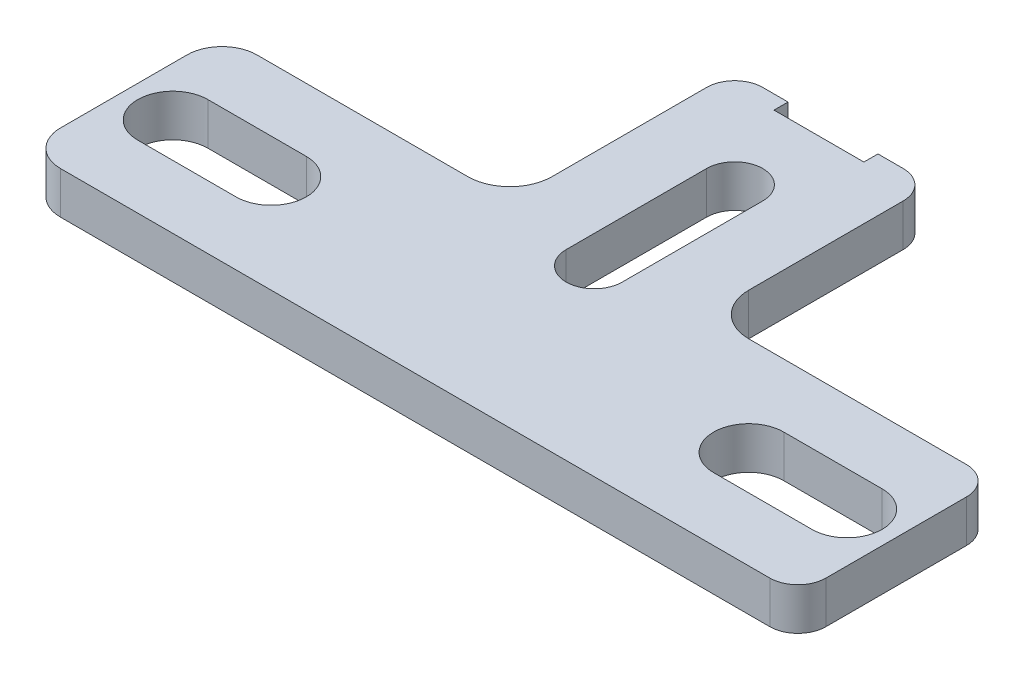
ISO-10303-21;
HEADER;
FILE_DESCRIPTION(('STEP AP214'),'2;1');
FILE_NAME('part.step','',(''),(''),'','','');
FILE_SCHEMA(('AUTOMOTIVE_DESIGN { 1 0 10303 214 1 1 1 1 }'));
ENDSEC;
DATA;
#1=APPLICATION_CONTEXT('core data for automotive mechanical design processes');
#2=APPLICATION_PROTOCOL_DEFINITION('international standard','automotive_design',2000,#1);
#3=PRODUCT_CONTEXT('',#1,'mechanical');
#4=PRODUCT('Part','Part','',(#3));
#5=PRODUCT_RELATED_PRODUCT_CATEGORY('part','',(#4));
#6=PRODUCT_DEFINITION_FORMATION('','',#4);
#7=PRODUCT_DEFINITION_CONTEXT('part definition',#1,'design');
#8=PRODUCT_DEFINITION('design','',#6,#7);
#9=PRODUCT_DEFINITION_SHAPE('','',#8);
#10=(LENGTH_UNIT() NAMED_UNIT(*) SI_UNIT(.MILLI.,.METRE.));
#11=(NAMED_UNIT(*) PLANE_ANGLE_UNIT() SI_UNIT($,.RADIAN.));
#12=(NAMED_UNIT(*) SI_UNIT($,.STERADIAN.) SOLID_ANGLE_UNIT());
#13=UNCERTAINTY_MEASURE_WITH_UNIT(LENGTH_MEASURE(1.E-05),#10,'distance_accuracy_value','');
#14=(GEOMETRIC_REPRESENTATION_CONTEXT(3) GLOBAL_UNCERTAINTY_ASSIGNED_CONTEXT((#13)) GLOBAL_UNIT_ASSIGNED_CONTEXT((#10,
#11,#12)) REPRESENTATION_CONTEXT('',''));
#15=CARTESIAN_POINT('',(0.,0.,0.));
#16=DIRECTION('',(0.,0.,1.));
#17=DIRECTION('',(1.,0.,0.));
#18=AXIS2_PLACEMENT_3D('',#15,#16,#17);
#19=CARTESIAN_POINT('',(27.5,3.,-15.));
#20=DIRECTION('',(0.,0.,1.));
#21=DIRECTION('',(1.,0.,0.));
#22=AXIS2_PLACEMENT_3D('',#19,#20,#21);
#23=PLANE('',#22);
#24=DIRECTION('',(-1.,0.,0.));
#25=VECTOR('',#24,1.);
#26=CARTESIAN_POINT('',(27.5,3.,-15.));
#27=LINE('',#26,#25);
#28=CARTESIAN_POINT('',(5.00000000001038,3.,-15.));
#29=VERTEX_POINT('',#28);
#30=CARTESIAN_POINT('',(3.2,3.,-15.));
#31=VERTEX_POINT('',#30);
#32=EDGE_CURVE('E393',#29,#31,#27,.T.);
#33=ORIENTED_EDGE('',*,*,#32,.F.);
#34=DIRECTION('',(0.,1.,0.));
#35=VECTOR('',#34,1.);
#36=CARTESIAN_POINT('',(5.00000000001038,3.,-15.));
#37=LINE('',#36,#35);
#38=CARTESIAN_POINT('',(5.00000000001038,0.,-15.));
#39=VERTEX_POINT('',#38);
#40=EDGE_CURVE('E442',#29,#39,#37,.F.);
#41=ORIENTED_EDGE('',*,*,#40,.T.);
#42=DIRECTION('',(-1.,0.,0.));
#43=VECTOR('',#42,1.);
#44=CARTESIAN_POINT('',(27.5,0.,-15.));
#45=LINE('',#44,#43);
#46=CARTESIAN_POINT('',(3.2,0.,-15.));
#47=VERTEX_POINT('',#46);
#48=EDGE_CURVE('E386',#39,#47,#45,.T.);
#49=ORIENTED_EDGE('',*,*,#48,.T.);
#50=DIRECTION('',(0.,1.,0.));
#51=VECTOR('',#50,1.);
#52=CARTESIAN_POINT('',(3.2,3.,-15.));
#53=LINE('',#52,#51);
#54=EDGE_CURVE('E263',#47,#31,#53,.T.);
#55=ORIENTED_EDGE('',*,*,#54,.T.);
#56=EDGE_LOOP('',(#33,#41,#49,#55));
#57=FACE_BOUND('',#56,.T.);
#58=ADVANCED_FACE('F34',(#57),#23,.F.);
#59=CARTESIAN_POINT('',(-27.5,3.,-15.));
#60=DIRECTION('',(1.,0.,0.));
#61=DIRECTION('',(0.,0.,-1.));
#62=AXIS2_PLACEMENT_3D('',#59,#60,#61);
#63=PLANE('',#62);
#64=DIRECTION('',(0.,0.,1.));
#65=VECTOR('',#64,1.);
#66=CARTESIAN_POINT('',(-27.5,0.,-15.));
#67=LINE('',#66,#65);
#68=CARTESIAN_POINT('',(-27.5,0.,3.5));
#69=VERTEX_POINT('',#68);
#70=CARTESIAN_POINT('',(-27.5,0.,12.5));
#71=VERTEX_POINT('',#70);
#72=EDGE_CURVE('E313',#69,#71,#67,.T.);
#73=ORIENTED_EDGE('',*,*,#72,.T.);
#74=DIRECTION('',(0.,-1.,0.));
#75=VECTOR('',#74,1.);
#76=CARTESIAN_POINT('',(-27.5,3.,12.5));
#77=LINE('',#76,#75);
#78=CARTESIAN_POINT('',(-27.5,3.,12.5));
#79=VERTEX_POINT('',#78);
#80=EDGE_CURVE('E462',#71,#79,#77,.F.);
#81=ORIENTED_EDGE('',*,*,#80,.T.);
#82=DIRECTION('',(0.,0.,1.));
#83=VECTOR('',#82,1.);
#84=CARTESIAN_POINT('',(-27.5,3.,-15.));
#85=LINE('',#84,#83);
#86=CARTESIAN_POINT('',(-27.5,3.,3.5));
#87=VERTEX_POINT('',#86);
#88=EDGE_CURVE('E382',#87,#79,#85,.T.);
#89=ORIENTED_EDGE('',*,*,#88,.F.);
#90=DIRECTION('',(0.,1.,0.));
#91=VECTOR('',#90,1.);
#92=CARTESIAN_POINT('',(-27.5,3.,3.5));
#93=LINE('',#92,#91);
#94=EDGE_CURVE('E460',#87,#69,#93,.F.);
#95=ORIENTED_EDGE('',*,*,#94,.T.);
#96=EDGE_LOOP('',(#73,#81,#89,#95));
#97=FACE_BOUND('',#96,.T.);
#98=ADVANCED_FACE('F526',(#97),#63,.F.);
#99=CARTESIAN_POINT('',(27.5,3.,15.));
#100=DIRECTION('',(0.,0.,-1.));
#101=DIRECTION('',(-1.,0.,0.));
#102=AXIS2_PLACEMENT_3D('',#99,#100,#101);
#103=PLANE('',#102);
#104=DIRECTION('',(1.,0.,0.));
#105=VECTOR('',#104,1.);
#106=CARTESIAN_POINT('',(27.5,0.,15.));
#107=LINE('',#106,#105);
#108=CARTESIAN_POINT('',(-25.,0.,15.));
#109=VERTEX_POINT('',#108);
#110=CARTESIAN_POINT('',(25.5,0.,15.));
#111=VERTEX_POINT('',#110);
#112=EDGE_CURVE('E397',#109,#111,#107,.T.);
#113=ORIENTED_EDGE('',*,*,#112,.T.);
#114=DIRECTION('',(0.,-1.,0.));
#115=VECTOR('',#114,1.);
#116=CARTESIAN_POINT('',(25.5,3.,15.));
#117=LINE('',#116,#115);
#118=CARTESIAN_POINT('',(25.5,3.,15.));
#119=VERTEX_POINT('',#118);
#120=EDGE_CURVE('E453',#111,#119,#117,.F.);
#121=ORIENTED_EDGE('',*,*,#120,.T.);
#122=DIRECTION('',(1.,0.,0.));
#123=VECTOR('',#122,1.);
#124=CARTESIAN_POINT('',(27.5,3.,15.));
#125=LINE('',#124,#123);
#126=CARTESIAN_POINT('',(-25.,3.,15.));
#127=VERTEX_POINT('',#126);
#128=EDGE_CURVE('E385',#127,#119,#125,.T.);
#129=ORIENTED_EDGE('',*,*,#128,.F.);
#130=DIRECTION('',(0.,-1.,0.));
#131=VECTOR('',#130,1.);
#132=CARTESIAN_POINT('',(-25.,3.,15.));
#133=LINE('',#132,#131);
#134=EDGE_CURVE('E450',#127,#109,#133,.T.);
#135=ORIENTED_EDGE('',*,*,#134,.T.);
#136=EDGE_LOOP('',(#113,#121,#129,#135));
#137=FACE_BOUND('',#136,.T.);
#138=ADVANCED_FACE('F518',(#137),#103,.F.);
#139=CARTESIAN_POINT('',(27.5,3.,-15.));
#140=DIRECTION('',(-1.,0.,0.));
#141=DIRECTION('',(0.,0.,1.));
#142=AXIS2_PLACEMENT_3D('',#139,#140,#141);
#143=PLANE('',#142);
#144=DIRECTION('',(0.,0.,-1.));
#145=VECTOR('',#144,1.);
#146=CARTESIAN_POINT('',(27.5,3.,-15.));
#147=LINE('',#146,#145);
#148=CARTESIAN_POINT('',(27.5,3.,13.));
#149=VERTEX_POINT('',#148);
#150=CARTESIAN_POINT('',(27.5,3.,2.9999999999998));
#151=VERTEX_POINT('',#150);
#152=EDGE_CURVE('E389',#149,#151,#147,.T.);
#153=ORIENTED_EDGE('',*,*,#152,.F.);
#154=DIRECTION('',(0.,-1.,0.));
#155=VECTOR('',#154,1.);
#156=CARTESIAN_POINT('',(27.5,3.,13.));
#157=LINE('',#156,#155);
#158=CARTESIAN_POINT('',(27.5,0.,13.));
#159=VERTEX_POINT('',#158);
#160=EDGE_CURVE('E447',#149,#159,#157,.T.);
#161=ORIENTED_EDGE('',*,*,#160,.T.);
#162=DIRECTION('',(0.,0.,-1.));
#163=VECTOR('',#162,1.);
#164=CARTESIAN_POINT('',(27.5,0.,-15.));
#165=LINE('',#164,#163);
#166=CARTESIAN_POINT('',(27.5,0.,2.9999999999998));
#167=VERTEX_POINT('',#166);
#168=EDGE_CURVE('E400',#159,#167,#165,.T.);
#169=ORIENTED_EDGE('',*,*,#168,.T.);
#170=DIRECTION('',(0.,1.,0.));
#171=VECTOR('',#170,1.);
#172=CARTESIAN_POINT('',(27.5,3.,2.9999999999998));
#173=LINE('',#172,#171);
#174=EDGE_CURVE('E444',#167,#151,#173,.T.);
#175=ORIENTED_EDGE('',*,*,#174,.T.);
#176=EDGE_LOOP('',(#153,#161,#169,#175));
#177=FACE_BOUND('',#176,.T.);
#178=ADVANCED_FACE('F510',(#177),#143,.F.);
#179=CARTESIAN_POINT('',(-3.2,0.,-15.));
#180=VERTEX_POINT('',#179);
#181=CARTESIAN_POINT('',(-5.00000000001048,0.,-15.));
#182=VERTEX_POINT('',#181);
#183=EDGE_CURVE('E403',#180,#182,#45,.T.);
#184=ORIENTED_EDGE('',*,*,#183,.T.);
#185=DIRECTION('',(0.,1.,0.));
#186=VECTOR('',#185,1.);
#187=CARTESIAN_POINT('',(-5.00000000001048,3.,-15.));
#188=LINE('',#187,#186);
#189=CARTESIAN_POINT('',(-5.00000000001048,3.,-15.));
#190=VERTEX_POINT('',#189);
#191=EDGE_CURVE('E406',#182,#190,#188,.T.);
#192=ORIENTED_EDGE('',*,*,#191,.T.);
#193=CARTESIAN_POINT('',(-3.2,3.,-15.));
#194=VERTEX_POINT('',#193);
#195=EDGE_CURVE('E392',#194,#190,#27,.T.);
#196=ORIENTED_EDGE('',*,*,#195,.F.);
#197=DIRECTION('',(0.,-1.,0.));
#198=VECTOR('',#197,1.);
#199=CARTESIAN_POINT('',(-3.2,3.,-15.));
#200=LINE('',#199,#198);
#201=EDGE_CURVE('E255',#194,#180,#200,.T.);
#202=ORIENTED_EDGE('',*,*,#201,.T.);
#203=EDGE_LOOP('',(#184,#192,#196,#202));
#204=FACE_BOUND('',#203,.T.);
#205=ADVANCED_FACE('F554',(#204),#23,.F.);
#206=CARTESIAN_POINT('',(0.,3.,0.));
#207=DIRECTION('',(0.,-1.,0.));
#208=DIRECTION('',(0.,0.,-1.));
#209=AXIS2_PLACEMENT_3D('',#206,#207,#208);
#210=PLANE('',#209);
#211=DIRECTION('',(1.,0.,0.));
#212=VECTOR('',#211,1.);
#213=CARTESIAN_POINT('',(17.0000000000035,3.,10.5));
#214=LINE('',#213,#212);
#215=CARTESIAN_POINT('',(17.0000000000035,3.,10.5));
#216=VERTEX_POINT('',#215);
#217=CARTESIAN_POINT('',(24.0000000000035,3.,10.5));
#218=VERTEX_POINT('',#217);
#219=EDGE_CURVE('E302',#216,#218,#214,.T.);
#220=ORIENTED_EDGE('',*,*,#219,.F.);
#221=CARTESIAN_POINT('',(17.0000000000035,3.,8.));
#222=DIRECTION('',(0.,1.,0.));
#223=DIRECTION('',(0.,0.,1.));
#224=AXIS2_PLACEMENT_3D('',#221,#222,#223);
#225=CIRCLE('',#224,2.5);
#226=CARTESIAN_POINT('',(17.0000000000035,3.,5.5));
#227=VERTEX_POINT('',#226);
#228=EDGE_CURVE('E300',#227,#216,#225,.T.);
#229=ORIENTED_EDGE('',*,*,#228,.F.);
#230=DIRECTION('',(-1.,0.,0.));
#231=VECTOR('',#230,1.);
#232=CARTESIAN_POINT('',(17.0000000000035,3.,5.5));
#233=LINE('',#232,#231);
#234=CARTESIAN_POINT('',(24.0000000000035,3.,5.5));
#235=VERTEX_POINT('',#234);
#236=EDGE_CURVE('E290',#235,#227,#233,.T.);
#237=ORIENTED_EDGE('',*,*,#236,.F.);
#238=CARTESIAN_POINT('',(24.0000000000035,3.,8.));
#239=DIRECTION('',(0.,1.,0.));
#240=DIRECTION('',(0.,0.,1.));
#241=AXIS2_PLACEMENT_3D('',#238,#239,#240);
#242=CIRCLE('',#241,2.5);
#243=EDGE_CURVE('E306',#218,#235,#242,.T.);
#244=ORIENTED_EDGE('',*,*,#243,.F.);
#245=EDGE_LOOP('',(#220,#229,#237,#244));
#246=FACE_BOUND('',#245,.T.);
#247=DIRECTION('',(-1.,0.,0.));
#248=VECTOR('',#247,1.);
#249=CARTESIAN_POINT('',(-17.0000000000035,3.,5.5));
#250=LINE('',#249,#248);
#251=CARTESIAN_POINT('',(-17.0000000000035,3.,5.5));
#252=VERTEX_POINT('',#251);
#253=CARTESIAN_POINT('',(-24.0000000000035,3.,5.5));
#254=VERTEX_POINT('',#253);
#255=EDGE_CURVE('E336',#252,#254,#250,.T.);
#256=ORIENTED_EDGE('',*,*,#255,.F.);
#257=CARTESIAN_POINT('',(-16.9999999999965,3.,8.));
#258=DIRECTION('',(0.,1.,0.));
#259=DIRECTION('',(0.,0.,-1.));
#260=AXIS2_PLACEMENT_3D('',#257,#258,#259);
#261=CIRCLE('',#260,2.5);
#262=CARTESIAN_POINT('',(-17.0000000000035,3.,10.5));
#263=VERTEX_POINT('',#262);
#264=EDGE_CURVE('E334',#263,#252,#261,.T.);
#265=ORIENTED_EDGE('',*,*,#264,.F.);
#266=DIRECTION('',(1.,0.,0.));
#267=VECTOR('',#266,1.);
#268=CARTESIAN_POINT('',(-17.0000000000035,3.,10.5));
#269=LINE('',#268,#267);
#270=CARTESIAN_POINT('',(-24.0000000000035,3.,10.5));
#271=VERTEX_POINT('',#270);
#272=EDGE_CURVE('E324',#271,#263,#269,.T.);
#273=ORIENTED_EDGE('',*,*,#272,.F.);
#274=CARTESIAN_POINT('',(-24.0000000000035,3.,8.));
#275=DIRECTION('',(0.,1.,0.));
#276=DIRECTION('',(0.,0.,-1.));
#277=AXIS2_PLACEMENT_3D('',#274,#275,#276);
#278=CIRCLE('',#277,2.5);
#279=EDGE_CURVE('E340',#254,#271,#278,.T.);
#280=ORIENTED_EDGE('',*,*,#279,.F.);
#281=EDGE_LOOP('',(#256,#265,#273,#280));
#282=FACE_BOUND('',#281,.T.);
#283=DIRECTION('',(0.,0.,-1.));
#284=VECTOR('',#283,1.);
#285=CARTESIAN_POINT('',(2.00000000001047,3.,2.));
#286=LINE('',#285,#284);
#287=CARTESIAN_POINT('',(2.00000000001047,3.,2.));
#288=VERTEX_POINT('',#287);
#289=CARTESIAN_POINT('',(2.,3.,-8.));
#290=VERTEX_POINT('',#289);
#291=EDGE_CURVE('E367',#288,#290,#286,.T.);
#292=ORIENTED_EDGE('',*,*,#291,.F.);
#293=CARTESIAN_POINT('',(-1.04728759679118E-11,3.,2.));
#294=DIRECTION('',(0.,1.,0.));
#295=DIRECTION('',(0.,0.,1.));
#296=AXIS2_PLACEMENT_3D('',#293,#294,#295);
#297=CIRCLE('',#296,2.00000000001047);
#298=CARTESIAN_POINT('',(-2.00000000001047,3.,2.));
#299=VERTEX_POINT('',#298);
#300=EDGE_CURVE('E285',#299,#288,#297,.T.);
#301=ORIENTED_EDGE('',*,*,#300,.F.);
#302=DIRECTION('',(0.,0.,1.));
#303=VECTOR('',#302,1.);
#304=CARTESIAN_POINT('',(-2.00000000001047,3.,2.));
#305=LINE('',#304,#303);
#306=CARTESIAN_POINT('',(-2.00000000001048,3.,-8.));
#307=VERTEX_POINT('',#306);
#308=EDGE_CURVE('E356',#307,#299,#305,.T.);
#309=ORIENTED_EDGE('',*,*,#308,.F.);
#310=CARTESIAN_POINT('',(-1.04747129381105E-11,3.,-8.));
#311=DIRECTION('',(0.,1.,0.));
#312=DIRECTION('',(0.,0.,1.));
#313=AXIS2_PLACEMENT_3D('',#310,#311,#312);
#314=CIRCLE('',#313,2.00000000001047);
#315=EDGE_CURVE('E370',#290,#307,#314,.T.);
#316=ORIENTED_EDGE('',*,*,#315,.F.);
#317=EDGE_LOOP('',(#292,#301,#309,#316));
#318=FACE_BOUND('',#317,.T.);
#319=ORIENTED_EDGE('',*,*,#195,.T.);
#320=CARTESIAN_POINT('',(-5.00000000001048,3.,-13.));
#321=DIRECTION('',(0.,-1.,0.));
#322=DIRECTION('',(0.,0.,-1.));
#323=AXIS2_PLACEMENT_3D('',#320,#321,#322);
#324=CIRCLE('',#323,2.);
#325=CARTESIAN_POINT('',(-7.00000000001048,3.,-13.));
#326=VERTEX_POINT('',#325);
#327=EDGE_CURVE('E419',#190,#326,#324,.F.);
#328=ORIENTED_EDGE('',*,*,#327,.T.);
#329=DIRECTION('',(0.,0.,-1.));
#330=VECTOR('',#329,1.);
#331=CARTESIAN_POINT('',(-7.00000000001048,3.,-15.));
#332=LINE('',#331,#330);
#333=CARTESIAN_POINT('',(-7.00000000001047,3.,-2.));
#334=VERTEX_POINT('',#333);
#335=EDGE_CURVE('E500',#334,#326,#332,.T.);
#336=ORIENTED_EDGE('',*,*,#335,.F.);
#337=CARTESIAN_POINT('',(-10.0000000000105,3.,-2.));
#338=DIRECTION('',(0.,-1.,0.));
#339=DIRECTION('',(0.,0.,-1.));
#340=AXIS2_PLACEMENT_3D('',#337,#338,#339);
#341=CIRCLE('',#340,3.);
#342=CARTESIAN_POINT('',(-10.0000000000105,3.,1.));
#343=VERTEX_POINT('',#342);
#344=EDGE_CURVE('E468',#334,#343,#341,.T.);
#345=ORIENTED_EDGE('',*,*,#344,.T.);
#346=DIRECTION('',(1.,0.,0.));
#347=VECTOR('',#346,1.);
#348=CARTESIAN_POINT('',(-7.00000000001047,3.,1.));
#349=LINE('',#348,#347);
#350=CARTESIAN_POINT('',(-25.,3.,1.));
#351=VERTEX_POINT('',#350);
#352=EDGE_CURVE('E498',#351,#343,#349,.T.);
#353=ORIENTED_EDGE('',*,*,#352,.F.);
#354=CARTESIAN_POINT('',(-25.,3.,3.5));
#355=DIRECTION('',(0.,-1.,0.));
#356=DIRECTION('',(0.,0.,-1.));
#357=AXIS2_PLACEMENT_3D('',#354,#355,#356);
#358=CIRCLE('',#357,2.5);
#359=EDGE_CURVE('E409',#351,#87,#358,.F.);
#360=ORIENTED_EDGE('',*,*,#359,.T.);
#361=ORIENTED_EDGE('',*,*,#88,.T.);
#362=CARTESIAN_POINT('',(-25.,3.,12.5));
#363=DIRECTION('',(0.,-1.,0.));
#364=DIRECTION('',(0.,0.,-1.));
#365=AXIS2_PLACEMENT_3D('',#362,#363,#364);
#366=CIRCLE('',#365,2.5);
#367=EDGE_CURVE('E411',#79,#127,#366,.F.);
#368=ORIENTED_EDGE('',*,*,#367,.T.);
#369=ORIENTED_EDGE('',*,*,#128,.T.);
#370=CARTESIAN_POINT('',(25.5,3.,13.));
#371=DIRECTION('',(0.,-1.,0.));
#372=DIRECTION('',(0.,0.,-1.));
#373=AXIS2_PLACEMENT_3D('',#370,#371,#372);
#374=CIRCLE('',#373,2.);
#375=EDGE_CURVE('E415',#119,#149,#374,.F.);
#376=ORIENTED_EDGE('',*,*,#375,.T.);
#377=ORIENTED_EDGE('',*,*,#152,.T.);
#378=CARTESIAN_POINT('',(25.5,3.,2.9999999999998));
#379=DIRECTION('',(0.,-1.,0.));
#380=DIRECTION('',(0.,0.,-1.));
#381=AXIS2_PLACEMENT_3D('',#378,#379,#380);
#382=CIRCLE('',#381,2.);
#383=CARTESIAN_POINT('',(25.5,3.,0.999999999999803));
#384=VERTEX_POINT('',#383);
#385=EDGE_CURVE('E413',#151,#384,#382,.F.);
#386=ORIENTED_EDGE('',*,*,#385,.T.);
#387=DIRECTION('',(1.,0.,0.));
#388=VECTOR('',#387,1.);
#389=CARTESIAN_POINT('',(7.00000000001048,3.,1.));
#390=LINE('',#389,#388);
#391=CARTESIAN_POINT('',(10.0000000000105,3.,0.99999999999997));
#392=VERTEX_POINT('',#391);
#393=EDGE_CURVE('E479',#392,#384,#390,.T.);
#394=ORIENTED_EDGE('',*,*,#393,.F.);
#395=CARTESIAN_POINT('',(10.0000000000105,3.,-2.00000000000003));
#396=DIRECTION('',(0.,-1.,0.));
#397=DIRECTION('',(0.,0.,-1.));
#398=AXIS2_PLACEMENT_3D('',#395,#396,#397);
#399=CIRCLE('',#398,3.);
#400=CARTESIAN_POINT('',(7.00000000001046,3.,-2.00000000000001));
#401=VERTEX_POINT('',#400);
#402=EDGE_CURVE('E42',#392,#401,#399,.T.);
#403=ORIENTED_EDGE('',*,*,#402,.T.);
#404=DIRECTION('',(0.,0.,1.));
#405=VECTOR('',#404,1.);
#406=CARTESIAN_POINT('',(7.00000000001037,3.,-15.));
#407=LINE('',#406,#405);
#408=CARTESIAN_POINT('',(7.00000000001038,3.,-13.));
#409=VERTEX_POINT('',#408);
#410=EDGE_CURVE('E477',#409,#401,#407,.T.);
#411=ORIENTED_EDGE('',*,*,#410,.F.);
#412=CARTESIAN_POINT('',(5.00000000001038,3.,-13.));
#413=DIRECTION('',(0.,-1.,0.));
#414=DIRECTION('',(0.,0.,-1.));
#415=AXIS2_PLACEMENT_3D('',#412,#413,#414);
#416=CIRCLE('',#415,2.);
#417=EDGE_CURVE('E417',#409,#29,#416,.F.);
#418=ORIENTED_EDGE('',*,*,#417,.T.);
#419=ORIENTED_EDGE('',*,*,#32,.T.);
#420=DIRECTION('',(0.,0.,-1.));
#421=VECTOR('',#420,1.);
#422=CARTESIAN_POINT('',(3.2,3.,-16.));
#423=LINE('',#422,#421);
#424=CARTESIAN_POINT('',(3.2,3.,-14.));
#425=VERTEX_POINT('',#424);
#426=EDGE_CURVE('E276',#425,#31,#423,.T.);
#427=ORIENTED_EDGE('',*,*,#426,.F.);
#428=DIRECTION('',(1.,0.,0.));
#429=VECTOR('',#428,1.);
#430=CARTESIAN_POINT('',(-3.2,3.,-14.));
#431=LINE('',#430,#429);
#432=CARTESIAN_POINT('',(-3.2,3.,-14.));
#433=VERTEX_POINT('',#432);
#434=EDGE_CURVE('E251',#433,#425,#431,.T.);
#435=ORIENTED_EDGE('',*,*,#434,.F.);
#436=DIRECTION('',(0.,0.,1.));
#437=VECTOR('',#436,1.);
#438=CARTESIAN_POINT('',(-3.2,3.,-16.));
#439=LINE('',#438,#437);
#440=EDGE_CURVE('E278',#194,#433,#439,.T.);
#441=ORIENTED_EDGE('',*,*,#440,.F.);
#442=EDGE_LOOP('',(#319,#328,#336,#345,#353,#360,#361,#368,#369,#376,#377,#386,#394,#403,#411,
#418,#419,#427,#435,#441));
#443=FACE_BOUND('',#442,.T.);
#444=ADVANCED_FACE('F476',(#246,#282,#318,#443),#210,.F.);
#445=CARTESIAN_POINT('',(0.,0.,0.));
#446=DIRECTION('',(0.,-1.,0.));
#447=DIRECTION('',(0.,0.,-1.));
#448=AXIS2_PLACEMENT_3D('',#445,#446,#447);
#449=PLANE('',#448);
#450=DIRECTION('',(0.,0.,-1.));
#451=VECTOR('',#450,1.);
#452=CARTESIAN_POINT('',(-7.00000000001048,0.,-15.));
#453=LINE('',#452,#451);
#454=CARTESIAN_POINT('',(-7.00000000001047,0.,-2.));
#455=VERTEX_POINT('',#454);
#456=CARTESIAN_POINT('',(-7.00000000001048,0.,-13.));
#457=VERTEX_POINT('',#456);
#458=EDGE_CURVE('E279',#455,#457,#453,.T.);
#459=ORIENTED_EDGE('',*,*,#458,.T.);
#460=CARTESIAN_POINT('',(-5.00000000001048,0.,-13.));
#461=DIRECTION('',(0.,-1.,0.));
#462=DIRECTION('',(0.,0.,-1.));
#463=AXIS2_PLACEMENT_3D('',#460,#461,#462);
#464=CIRCLE('',#463,2.);
#465=EDGE_CURVE('E435',#457,#182,#464,.T.);
#466=ORIENTED_EDGE('',*,*,#465,.T.);
#467=ORIENTED_EDGE('',*,*,#183,.F.);
#468=DIRECTION('',(0.,0.,-1.));
#469=VECTOR('',#468,1.);
#470=CARTESIAN_POINT('',(-3.2,0.,0.));
#471=LINE('',#470,#469);
#472=CARTESIAN_POINT('',(-3.2,0.,-14.));
#473=VERTEX_POINT('',#472);
#474=EDGE_CURVE('E271',#473,#180,#471,.T.);
#475=ORIENTED_EDGE('',*,*,#474,.F.);
#476=DIRECTION('',(1.,0.,0.));
#477=VECTOR('',#476,1.);
#478=CARTESIAN_POINT('',(-3.2,0.,-14.));
#479=LINE('',#478,#477);
#480=CARTESIAN_POINT('',(3.2,0.,-14.));
#481=VERTEX_POINT('',#480);
#482=EDGE_CURVE('E248',#473,#481,#479,.T.);
#483=ORIENTED_EDGE('',*,*,#482,.T.);
#484=DIRECTION('',(0.,0.,-1.));
#485=VECTOR('',#484,1.);
#486=CARTESIAN_POINT('',(3.2,0.,-16.));
#487=LINE('',#486,#485);
#488=EDGE_CURVE('E260',#481,#47,#487,.T.);
#489=ORIENTED_EDGE('',*,*,#488,.T.);
#490=ORIENTED_EDGE('',*,*,#48,.F.);
#491=CARTESIAN_POINT('',(5.00000000001038,0.,-13.));
#492=DIRECTION('',(0.,-1.,0.));
#493=DIRECTION('',(0.,0.,-1.));
#494=AXIS2_PLACEMENT_3D('',#491,#492,#493);
#495=CIRCLE('',#494,2.);
#496=CARTESIAN_POINT('',(7.00000000001038,0.,-13.));
#497=VERTEX_POINT('',#496);
#498=EDGE_CURVE('E433',#39,#497,#495,.T.);
#499=ORIENTED_EDGE('',*,*,#498,.T.);
#500=DIRECTION('',(0.,0.,1.));
#501=VECTOR('',#500,1.);
#502=CARTESIAN_POINT('',(7.00000000001037,0.,-15.));
#503=LINE('',#502,#501);
#504=CARTESIAN_POINT('',(7.00000000001046,0.,-2.00000000000001));
#505=VERTEX_POINT('',#504);
#506=EDGE_CURVE('E494',#497,#505,#503,.T.);
#507=ORIENTED_EDGE('',*,*,#506,.T.);
#508=CARTESIAN_POINT('',(10.0000000000105,0.,-2.00000000000003));
#509=DIRECTION('',(0.,-1.,0.));
#510=DIRECTION('',(0.,0.,-1.));
#511=AXIS2_PLACEMENT_3D('',#508,#509,#510);
#512=CIRCLE('',#511,3.);
#513=CARTESIAN_POINT('',(10.0000000000105,0.,0.99999999999997));
#514=VERTEX_POINT('',#513);
#515=EDGE_CURVE('E12',#505,#514,#512,.F.);
#516=ORIENTED_EDGE('',*,*,#515,.T.);
#517=DIRECTION('',(1.,0.,0.));
#518=VECTOR('',#517,1.);
#519=CARTESIAN_POINT('',(7.00000000001048,0.,1.));
#520=LINE('',#519,#518);
#521=CARTESIAN_POINT('',(25.5,0.,0.999999999999803));
#522=VERTEX_POINT('',#521);
#523=EDGE_CURVE('E492',#514,#522,#520,.T.);
#524=ORIENTED_EDGE('',*,*,#523,.T.);
#525=CARTESIAN_POINT('',(25.5,0.,2.9999999999998));
#526=DIRECTION('',(0.,-1.,0.));
#527=DIRECTION('',(0.,0.,-1.));
#528=AXIS2_PLACEMENT_3D('',#525,#526,#527);
#529=CIRCLE('',#528,2.);
#530=EDGE_CURVE('E429',#522,#167,#529,.T.);
#531=ORIENTED_EDGE('',*,*,#530,.T.);
#532=ORIENTED_EDGE('',*,*,#168,.F.);
#533=CARTESIAN_POINT('',(25.5,0.,13.));
#534=DIRECTION('',(0.,-1.,0.));
#535=DIRECTION('',(0.,0.,-1.));
#536=AXIS2_PLACEMENT_3D('',#533,#534,#535);
#537=CIRCLE('',#536,2.);
#538=EDGE_CURVE('E431',#159,#111,#537,.T.);
#539=ORIENTED_EDGE('',*,*,#538,.T.);
#540=ORIENTED_EDGE('',*,*,#112,.F.);
#541=CARTESIAN_POINT('',(-25.,0.,12.5));
#542=DIRECTION('',(0.,-1.,0.));
#543=DIRECTION('',(0.,0.,-1.));
#544=AXIS2_PLACEMENT_3D('',#541,#542,#543);
#545=CIRCLE('',#544,2.5);
#546=EDGE_CURVE('E427',#109,#71,#545,.T.);
#547=ORIENTED_EDGE('',*,*,#546,.T.);
#548=ORIENTED_EDGE('',*,*,#72,.F.);
#549=CARTESIAN_POINT('',(-25.,0.,3.5));
#550=DIRECTION('',(0.,-1.,0.));
#551=DIRECTION('',(0.,0.,-1.));
#552=AXIS2_PLACEMENT_3D('',#549,#550,#551);
#553=CIRCLE('',#552,2.5);
#554=CARTESIAN_POINT('',(-25.,0.,1.));
#555=VERTEX_POINT('',#554);
#556=EDGE_CURVE('E56',#69,#555,#553,.T.);
#557=ORIENTED_EDGE('',*,*,#556,.T.);
#558=DIRECTION('',(1.,0.,0.));
#559=VECTOR('',#558,1.);
#560=CARTESIAN_POINT('',(-7.00000000001047,0.,1.));
#561=LINE('',#560,#559);
#562=CARTESIAN_POINT('',(-10.0000000000105,0.,1.));
#563=VERTEX_POINT('',#562);
#564=EDGE_CURVE('E534',#555,#563,#561,.T.);
#565=ORIENTED_EDGE('',*,*,#564,.T.);
#566=CARTESIAN_POINT('',(-10.0000000000105,0.,-2.));
#567=DIRECTION('',(0.,-1.,0.));
#568=DIRECTION('',(0.,0.,-1.));
#569=AXIS2_PLACEMENT_3D('',#566,#567,#568);
#570=CIRCLE('',#569,3.);
#571=EDGE_CURVE('E470',#563,#455,#570,.F.);
#572=ORIENTED_EDGE('',*,*,#571,.T.);
#573=EDGE_LOOP('',(#459,#466,#467,#475,#483,#489,#490,#499,#507,#516,#524,#531,#532,#539,#540,
#547,#548,#557,#565,#572));
#574=FACE_BOUND('',#573,.T.);
#575=CARTESIAN_POINT('',(17.0000000000035,0.,8.));
#576=DIRECTION('',(0.,1.,0.));
#577=DIRECTION('',(0.,0.,1.));
#578=AXIS2_PLACEMENT_3D('',#575,#576,#577);
#579=CIRCLE('',#578,2.5);
#580=CARTESIAN_POINT('',(17.0000000000035,0.,5.5));
#581=VERTEX_POINT('',#580);
#582=CARTESIAN_POINT('',(17.0000000000035,0.,10.5));
#583=VERTEX_POINT('',#582);
#584=EDGE_CURVE('E286',#581,#583,#579,.T.);
#585=ORIENTED_EDGE('',*,*,#584,.T.);
#586=DIRECTION('',(1.,0.,0.));
#587=VECTOR('',#586,1.);
#588=CARTESIAN_POINT('',(17.0000000000035,0.,10.5));
#589=LINE('',#588,#587);
#590=CARTESIAN_POINT('',(24.0000000000035,0.,10.5));
#591=VERTEX_POINT('',#590);
#592=EDGE_CURVE('E289',#583,#591,#589,.T.);
#593=ORIENTED_EDGE('',*,*,#592,.T.);
#594=CARTESIAN_POINT('',(24.0000000000035,0.,8.));
#595=DIRECTION('',(0.,1.,0.));
#596=DIRECTION('',(0.,0.,1.));
#597=AXIS2_PLACEMENT_3D('',#594,#595,#596);
#598=CIRCLE('',#597,2.5);
#599=CARTESIAN_POINT('',(24.0000000000035,0.,5.5));
#600=VERTEX_POINT('',#599);
#601=EDGE_CURVE('E293',#591,#600,#598,.T.);
#602=ORIENTED_EDGE('',*,*,#601,.T.);
#603=DIRECTION('',(-1.,0.,0.));
#604=VECTOR('',#603,1.);
#605=CARTESIAN_POINT('',(17.0000000000035,0.,5.5));
#606=LINE('',#605,#604);
#607=EDGE_CURVE('E296',#600,#581,#606,.T.);
#608=ORIENTED_EDGE('',*,*,#607,.T.);
#609=EDGE_LOOP('',(#585,#593,#602,#608));
#610=FACE_BOUND('',#609,.T.);
#611=CARTESIAN_POINT('',(-16.9999999999965,0.,8.));
#612=DIRECTION('',(0.,1.,0.));
#613=DIRECTION('',(0.,0.,-1.));
#614=AXIS2_PLACEMENT_3D('',#611,#612,#613);
#615=CIRCLE('',#614,2.5);
#616=CARTESIAN_POINT('',(-17.0000000000035,0.,10.5));
#617=VERTEX_POINT('',#616);
#618=CARTESIAN_POINT('',(-17.0000000000035,0.,5.5));
#619=VERTEX_POINT('',#618);
#620=EDGE_CURVE('E320',#617,#619,#615,.T.);
#621=ORIENTED_EDGE('',*,*,#620,.T.);
#622=DIRECTION('',(-1.,0.,0.));
#623=VECTOR('',#622,1.);
#624=CARTESIAN_POINT('',(-17.0000000000035,0.,5.5));
#625=LINE('',#624,#623);
#626=CARTESIAN_POINT('',(-24.0000000000035,0.,5.5));
#627=VERTEX_POINT('',#626);
#628=EDGE_CURVE('E323',#619,#627,#625,.T.);
#629=ORIENTED_EDGE('',*,*,#628,.T.);
#630=CARTESIAN_POINT('',(-24.0000000000035,0.,8.));
#631=DIRECTION('',(0.,1.,0.));
#632=DIRECTION('',(0.,0.,-1.));
#633=AXIS2_PLACEMENT_3D('',#630,#631,#632);
#634=CIRCLE('',#633,2.5);
#635=CARTESIAN_POINT('',(-24.0000000000035,0.,10.5));
#636=VERTEX_POINT('',#635);
#637=EDGE_CURVE('E327',#627,#636,#634,.T.);
#638=ORIENTED_EDGE('',*,*,#637,.T.);
#639=DIRECTION('',(1.,0.,0.));
#640=VECTOR('',#639,1.);
#641=CARTESIAN_POINT('',(-17.0000000000035,0.,10.5));
#642=LINE('',#641,#640);
#643=EDGE_CURVE('E330',#636,#617,#642,.T.);
#644=ORIENTED_EDGE('',*,*,#643,.T.);
#645=EDGE_LOOP('',(#621,#629,#638,#644));
#646=FACE_BOUND('',#645,.T.);
#647=CARTESIAN_POINT('',(-1.04728759679118E-11,0.,2.));
#648=DIRECTION('',(0.,1.,0.));
#649=DIRECTION('',(0.,0.,1.));
#650=AXIS2_PLACEMENT_3D('',#647,#648,#649);
#651=CIRCLE('',#650,2.00000000001047);
#652=CARTESIAN_POINT('',(-2.00000000001047,0.,2.));
#653=VERTEX_POINT('',#652);
#654=CARTESIAN_POINT('',(2.00000000001047,0.,2.));
#655=VERTEX_POINT('',#654);
#656=EDGE_CURVE('E352',#653,#655,#651,.T.);
#657=ORIENTED_EDGE('',*,*,#656,.T.);
#658=DIRECTION('',(0.,0.,-1.));
#659=VECTOR('',#658,1.);
#660=CARTESIAN_POINT('',(2.00000000001047,0.,2.));
#661=LINE('',#660,#659);
#662=CARTESIAN_POINT('',(2.00000000001047,0.,-8.));
#663=VERTEX_POINT('',#662);
#664=EDGE_CURVE('E355',#655,#663,#661,.T.);
#665=ORIENTED_EDGE('',*,*,#664,.T.);
#666=CARTESIAN_POINT('',(-1.04747129381105E-11,0.,-8.));
#667=DIRECTION('',(0.,1.,0.));
#668=DIRECTION('',(0.,0.,1.));
#669=AXIS2_PLACEMENT_3D('',#666,#667,#668);
#670=CIRCLE('',#669,2.00000000001047);
#671=CARTESIAN_POINT('',(-2.00000000001048,0.,-8.));
#672=VERTEX_POINT('',#671);
#673=EDGE_CURVE('E359',#663,#672,#670,.T.);
#674=ORIENTED_EDGE('',*,*,#673,.T.);
#675=DIRECTION('',(0.,0.,1.));
#676=VECTOR('',#675,1.);
#677=CARTESIAN_POINT('',(-2.00000000001047,0.,2.));
#678=LINE('',#677,#676);
#679=EDGE_CURVE('E362',#672,#653,#678,.T.);
#680=ORIENTED_EDGE('',*,*,#679,.T.);
#681=EDGE_LOOP('',(#657,#665,#674,#680));
#682=FACE_BOUND('',#681,.T.);
#683=ADVANCED_FACE('F268',(#574,#610,#646,#682),#449,.T.);
#684=CARTESIAN_POINT('',(-1.04728759679118E-11,0.,2.));
#685=DIRECTION('',(0.,1.,0.));
#686=DIRECTION('',(0.,0.,1.));
#687=AXIS2_PLACEMENT_3D('',#684,#685,#686);
#688=CYLINDRICAL_SURFACE('',#687,2.00000000001047);
#689=ORIENTED_EDGE('',*,*,#300,.T.);
#690=DIRECTION('',(0.,1.,0.));
#691=VECTOR('',#690,1.);
#692=CARTESIAN_POINT('',(2.00000000001047,0.,2.));
#693=LINE('',#692,#691);
#694=EDGE_CURVE('E365',#655,#288,#693,.T.);
#695=ORIENTED_EDGE('',*,*,#694,.F.);
#696=ORIENTED_EDGE('',*,*,#656,.F.);
#697=DIRECTION('',(0.,1.,0.));
#698=VECTOR('',#697,1.);
#699=CARTESIAN_POINT('',(-2.00000000001047,0.,2.));
#700=LINE('',#699,#698);
#701=EDGE_CURVE('E337',#653,#299,#700,.T.);
#702=ORIENTED_EDGE('',*,*,#701,.T.);
#703=EDGE_LOOP('',(#689,#695,#696,#702));
#704=FACE_BOUND('',#703,.T.);
#705=ADVANCED_FACE('F690',(#704),#688,.F.);
#706=CARTESIAN_POINT('',(-2.00000000001047,0.,2.));
#707=DIRECTION('',(-1.,0.,0.));
#708=DIRECTION('',(0.,0.,1.));
#709=AXIS2_PLACEMENT_3D('',#706,#707,#708);
#710=PLANE('',#709);
#711=ORIENTED_EDGE('',*,*,#308,.T.);
#712=ORIENTED_EDGE('',*,*,#701,.F.);
#713=ORIENTED_EDGE('',*,*,#679,.F.);
#714=DIRECTION('',(0.,1.,0.));
#715=VECTOR('',#714,1.);
#716=CARTESIAN_POINT('',(-2.00000000001048,0.,-8.));
#717=LINE('',#716,#715);
#718=EDGE_CURVE('E376',#672,#307,#717,.T.);
#719=ORIENTED_EDGE('',*,*,#718,.T.);
#720=EDGE_LOOP('',(#711,#712,#713,#719));
#721=FACE_BOUND('',#720,.T.);
#722=ADVANCED_FACE('F835',(#721),#710,.F.);
#723=CARTESIAN_POINT('',(-1.04747129381105E-11,0.,-8.));
#724=DIRECTION('',(0.,1.,0.));
#725=DIRECTION('',(0.,0.,1.));
#726=AXIS2_PLACEMENT_3D('',#723,#724,#725);
#727=CYLINDRICAL_SURFACE('',#726,2.00000000001047);
#728=ORIENTED_EDGE('',*,*,#315,.T.);
#729=ORIENTED_EDGE('',*,*,#718,.F.);
#730=ORIENTED_EDGE('',*,*,#673,.F.);
#731=DIRECTION('',(0.,1.,0.));
#732=VECTOR('',#731,1.);
#733=CARTESIAN_POINT('',(2.,0.,-8.));
#734=LINE('',#733,#732);
#735=EDGE_CURVE('E378',#663,#290,#734,.T.);
#736=ORIENTED_EDGE('',*,*,#735,.T.);
#737=EDGE_LOOP('',(#728,#729,#730,#736));
#738=FACE_BOUND('',#737,.T.);
#739=ADVANCED_FACE('F825',(#738),#727,.F.);
#740=CARTESIAN_POINT('',(2.00000000001047,0.,2.));
#741=DIRECTION('',(1.,0.,0.));
#742=DIRECTION('',(0.,0.,-1.));
#743=AXIS2_PLACEMENT_3D('',#740,#741,#742);
#744=PLANE('',#743);
#745=ORIENTED_EDGE('',*,*,#291,.T.);
#746=ORIENTED_EDGE('',*,*,#735,.F.);
#747=ORIENTED_EDGE('',*,*,#664,.F.);
#748=ORIENTED_EDGE('',*,*,#694,.T.);
#749=EDGE_LOOP('',(#745,#746,#747,#748));
#750=FACE_BOUND('',#749,.T.);
#751=ADVANCED_FACE('F815',(#750),#744,.F.);
#752=CARTESIAN_POINT('',(-16.9999999999965,0.,8.));
#753=DIRECTION('',(0.,1.,0.));
#754=DIRECTION('',(0.,0.,1.));
#755=AXIS2_PLACEMENT_3D('',#752,#753,#754);
#756=CYLINDRICAL_SURFACE('',#755,2.5);
#757=ORIENTED_EDGE('',*,*,#264,.T.);
#758=DIRECTION('',(0.,1.,0.));
#759=VECTOR('',#758,1.);
#760=CARTESIAN_POINT('',(-17.0000000000035,0.,5.5));
#761=LINE('',#760,#759);
#762=EDGE_CURVE('E333',#619,#252,#761,.T.);
#763=ORIENTED_EDGE('',*,*,#762,.F.);
#764=ORIENTED_EDGE('',*,*,#620,.F.);
#765=DIRECTION('',(0.,1.,0.));
#766=VECTOR('',#765,1.);
#767=CARTESIAN_POINT('',(-17.0000000000035,0.,10.5));
#768=LINE('',#767,#766);
#769=EDGE_CURVE('E303',#617,#263,#768,.T.);
#770=ORIENTED_EDGE('',*,*,#769,.T.);
#771=EDGE_LOOP('',(#757,#763,#764,#770));
#772=FACE_BOUND('',#771,.T.);
#773=ADVANCED_FACE('F805',(#772),#756,.F.);
#774=CARTESIAN_POINT('',(-17.0000000000035,0.,10.5));
#775=DIRECTION('',(0.,0.,1.));
#776=DIRECTION('',(1.,0.,0.));
#777=AXIS2_PLACEMENT_3D('',#774,#775,#776);
#778=PLANE('',#777);
#779=ORIENTED_EDGE('',*,*,#272,.T.);
#780=ORIENTED_EDGE('',*,*,#769,.F.);
#781=ORIENTED_EDGE('',*,*,#643,.F.);
#782=DIRECTION('',(0.,1.,0.));
#783=VECTOR('',#782,1.);
#784=CARTESIAN_POINT('',(-24.0000000000035,0.,10.5));
#785=LINE('',#784,#783);
#786=EDGE_CURVE('E346',#636,#271,#785,.T.);
#787=ORIENTED_EDGE('',*,*,#786,.T.);
#788=EDGE_LOOP('',(#779,#780,#781,#787));
#789=FACE_BOUND('',#788,.T.);
#790=ADVANCED_FACE('F795',(#789),#778,.F.);
#791=CARTESIAN_POINT('',(-24.0000000000035,0.,8.));
#792=DIRECTION('',(0.,1.,0.));
#793=DIRECTION('',(0.,0.,1.));
#794=AXIS2_PLACEMENT_3D('',#791,#792,#793);
#795=CYLINDRICAL_SURFACE('',#794,2.5);
#796=ORIENTED_EDGE('',*,*,#279,.T.);
#797=ORIENTED_EDGE('',*,*,#786,.F.);
#798=ORIENTED_EDGE('',*,*,#637,.F.);
#799=DIRECTION('',(0.,1.,0.));
#800=VECTOR('',#799,1.);
#801=CARTESIAN_POINT('',(-24.0000000000035,0.,5.5));
#802=LINE('',#801,#800);
#803=EDGE_CURVE('E348',#627,#254,#802,.T.);
#804=ORIENTED_EDGE('',*,*,#803,.T.);
#805=EDGE_LOOP('',(#796,#797,#798,#804));
#806=FACE_BOUND('',#805,.T.);
#807=ADVANCED_FACE('F785',(#806),#795,.F.);
#808=CARTESIAN_POINT('',(-17.0000000000035,0.,5.5));
#809=DIRECTION('',(0.,0.,-1.));
#810=DIRECTION('',(-1.,0.,0.));
#811=AXIS2_PLACEMENT_3D('',#808,#809,#810);
#812=PLANE('',#811);
#813=ORIENTED_EDGE('',*,*,#255,.T.);
#814=ORIENTED_EDGE('',*,*,#803,.F.);
#815=ORIENTED_EDGE('',*,*,#628,.F.);
#816=ORIENTED_EDGE('',*,*,#762,.T.);
#817=EDGE_LOOP('',(#813,#814,#815,#816));
#818=FACE_BOUND('',#817,.T.);
#819=ADVANCED_FACE('F775',(#818),#812,.F.);
#820=CARTESIAN_POINT('',(17.0000000000035,0.,8.));
#821=DIRECTION('',(0.,1.,0.));
#822=DIRECTION('',(0.,0.,1.));
#823=AXIS2_PLACEMENT_3D('',#820,#821,#822);
#824=CYLINDRICAL_SURFACE('',#823,2.5);
#825=ORIENTED_EDGE('',*,*,#228,.T.);
#826=DIRECTION('',(0.,1.,0.));
#827=VECTOR('',#826,1.);
#828=CARTESIAN_POINT('',(17.0000000000035,0.,10.5));
#829=LINE('',#828,#827);
#830=EDGE_CURVE('E299',#583,#216,#829,.T.);
#831=ORIENTED_EDGE('',*,*,#830,.F.);
#832=ORIENTED_EDGE('',*,*,#584,.F.);
#833=DIRECTION('',(0.,1.,0.));
#834=VECTOR('',#833,1.);
#835=CARTESIAN_POINT('',(17.0000000000035,0.,5.5));
#836=LINE('',#835,#834);
#837=EDGE_CURVE('E311',#581,#227,#836,.T.);
#838=ORIENTED_EDGE('',*,*,#837,.T.);
#839=EDGE_LOOP('',(#825,#831,#832,#838));
#840=FACE_BOUND('',#839,.T.);
#841=ADVANCED_FACE('F765',(#840),#824,.F.);
#842=CARTESIAN_POINT('',(17.0000000000035,0.,5.5));
#843=DIRECTION('',(0.,0.,-1.));
#844=DIRECTION('',(-1.,0.,0.));
#845=AXIS2_PLACEMENT_3D('',#842,#843,#844);
#846=PLANE('',#845);
#847=ORIENTED_EDGE('',*,*,#236,.T.);
#848=ORIENTED_EDGE('',*,*,#837,.F.);
#849=ORIENTED_EDGE('',*,*,#607,.F.);
#850=DIRECTION('',(0.,1.,0.));
#851=VECTOR('',#850,1.);
#852=CARTESIAN_POINT('',(24.0000000000035,0.,5.5));
#853=LINE('',#852,#851);
#854=EDGE_CURVE('E314',#600,#235,#853,.T.);
#855=ORIENTED_EDGE('',*,*,#854,.T.);
#856=EDGE_LOOP('',(#847,#848,#849,#855));
#857=FACE_BOUND('',#856,.T.);
#858=ADVANCED_FACE('F755',(#857),#846,.F.);
#859=CARTESIAN_POINT('',(24.0000000000035,0.,8.));
#860=DIRECTION('',(0.,1.,0.));
#861=DIRECTION('',(0.,0.,1.));
#862=AXIS2_PLACEMENT_3D('',#859,#860,#861);
#863=CYLINDRICAL_SURFACE('',#862,2.5);
#864=ORIENTED_EDGE('',*,*,#243,.T.);
#865=ORIENTED_EDGE('',*,*,#854,.F.);
#866=ORIENTED_EDGE('',*,*,#601,.F.);
#867=DIRECTION('',(0.,1.,0.));
#868=VECTOR('',#867,1.);
#869=CARTESIAN_POINT('',(24.0000000000035,0.,10.5));
#870=LINE('',#869,#868);
#871=EDGE_CURVE('E316',#591,#218,#870,.T.);
#872=ORIENTED_EDGE('',*,*,#871,.T.);
#873=EDGE_LOOP('',(#864,#865,#866,#872));
#874=FACE_BOUND('',#873,.T.);
#875=ADVANCED_FACE('F745',(#874),#863,.F.);
#876=CARTESIAN_POINT('',(17.0000000000035,0.,10.5));
#877=DIRECTION('',(0.,0.,1.));
#878=DIRECTION('',(1.,0.,0.));
#879=AXIS2_PLACEMENT_3D('',#876,#877,#878);
#880=PLANE('',#879);
#881=ORIENTED_EDGE('',*,*,#219,.T.);
#882=ORIENTED_EDGE('',*,*,#871,.F.);
#883=ORIENTED_EDGE('',*,*,#592,.F.);
#884=ORIENTED_EDGE('',*,*,#830,.T.);
#885=EDGE_LOOP('',(#881,#882,#883,#884));
#886=FACE_BOUND('',#885,.T.);
#887=ADVANCED_FACE('F565',(#886),#880,.F.);
#888=CARTESIAN_POINT('',(3.2,0.,-16.));
#889=DIRECTION('',(1.,0.,0.));
#890=DIRECTION('',(0.,0.,-1.));
#891=AXIS2_PLACEMENT_3D('',#888,#889,#890);
#892=PLANE('',#891);
#893=ORIENTED_EDGE('',*,*,#488,.F.);
#894=DIRECTION('',(0.,1.,0.));
#895=VECTOR('',#894,1.);
#896=CARTESIAN_POINT('',(3.2,0.,-14.));
#897=LINE('',#896,#895);
#898=EDGE_CURVE('E243',#481,#425,#897,.T.);
#899=ORIENTED_EDGE('',*,*,#898,.T.);
#900=ORIENTED_EDGE('',*,*,#426,.T.);
#901=ORIENTED_EDGE('',*,*,#54,.F.);
#902=EDGE_LOOP('',(#893,#899,#900,#901));
#903=FACE_BOUND('',#902,.T.);
#904=ADVANCED_FACE('F261',(#903),#892,.F.);
#905=CARTESIAN_POINT('',(-3.2,0.,-16.));
#906=DIRECTION('',(-1.,0.,0.));
#907=DIRECTION('',(0.,0.,1.));
#908=AXIS2_PLACEMENT_3D('',#905,#906,#907);
#909=PLANE('',#908);
#910=ORIENTED_EDGE('',*,*,#440,.T.);
#911=DIRECTION('',(0.,1.,0.));
#912=VECTOR('',#911,1.);
#913=CARTESIAN_POINT('',(-3.2,0.,-14.));
#914=LINE('',#913,#912);
#915=EDGE_CURVE('E256',#473,#433,#914,.T.);
#916=ORIENTED_EDGE('',*,*,#915,.F.);
#917=ORIENTED_EDGE('',*,*,#474,.T.);
#918=ORIENTED_EDGE('',*,*,#201,.F.);
#919=EDGE_LOOP('',(#910,#916,#917,#918));
#920=FACE_BOUND('',#919,.T.);
#921=ADVANCED_FACE('F557',(#920),#909,.F.);
#922=CARTESIAN_POINT('',(-3.2,0.,-14.));
#923=DIRECTION('',(0.,0.,1.));
#924=DIRECTION('',(1.,0.,0.));
#925=AXIS2_PLACEMENT_3D('',#922,#923,#924);
#926=PLANE('',#925);
#927=ORIENTED_EDGE('',*,*,#434,.T.);
#928=ORIENTED_EDGE('',*,*,#898,.F.);
#929=ORIENTED_EDGE('',*,*,#482,.F.);
#930=ORIENTED_EDGE('',*,*,#915,.T.);
#931=EDGE_LOOP('',(#927,#928,#929,#930));
#932=FACE_BOUND('',#931,.T.);
#933=ADVANCED_FACE('F245',(#932),#926,.F.);
#934=CARTESIAN_POINT('',(7.00000000001048,0.,1.));
#935=DIRECTION('',(0.,0.,1.));
#936=DIRECTION('',(1.,0.,0.));
#937=AXIS2_PLACEMENT_3D('',#934,#935,#936);
#938=PLANE('',#937);
#939=ORIENTED_EDGE('',*,*,#393,.T.);
#940=DIRECTION('',(0.,1.,0.));
#941=VECTOR('',#940,1.);
#942=CARTESIAN_POINT('',(25.5,0.,0.999999999999803));
#943=LINE('',#942,#941);
#944=EDGE_CURVE('E458',#384,#522,#943,.F.);
#945=ORIENTED_EDGE('',*,*,#944,.T.);
#946=ORIENTED_EDGE('',*,*,#523,.F.);
#947=DIRECTION('',(0.,1.,0.));
#948=VECTOR('',#947,1.);
#949=CARTESIAN_POINT('',(10.0000000000105,3.,0.99999999999997));
#950=LINE('',#949,#948);
#951=EDGE_CURVE('E455',#514,#392,#950,.T.);
#952=ORIENTED_EDGE('',*,*,#951,.T.);
#953=EDGE_LOOP('',(#939,#945,#946,#952));
#954=FACE_BOUND('',#953,.T.);
#955=ADVANCED_FACE('F496',(#954),#938,.F.);
#956=CARTESIAN_POINT('',(7.00000000001037,0.,-15.));
#957=DIRECTION('',(-1.,0.,0.));
#958=DIRECTION('',(0.,0.,1.));
#959=AXIS2_PLACEMENT_3D('',#956,#957,#958);
#960=PLANE('',#959);
#961=ORIENTED_EDGE('',*,*,#506,.F.);
#962=DIRECTION('',(0.,1.,0.));
#963=VECTOR('',#962,1.);
#964=CARTESIAN_POINT('',(7.00000000001038,0.,-13.));
#965=LINE('',#964,#963);
#966=EDGE_CURVE('E439',#497,#409,#965,.T.);
#967=ORIENTED_EDGE('',*,*,#966,.T.);
#968=ORIENTED_EDGE('',*,*,#410,.T.);
#969=DIRECTION('',(0.,1.,0.));
#970=VECTOR('',#969,1.);
#971=CARTESIAN_POINT('',(7.00000000001046,0.,-2.00000000000001));
#972=LINE('',#971,#970);
#973=EDGE_CURVE('E437',#401,#505,#972,.F.);
#974=ORIENTED_EDGE('',*,*,#973,.T.);
#975=EDGE_LOOP('',(#961,#967,#968,#974));
#976=FACE_BOUND('',#975,.T.);
#977=ADVANCED_FACE('F485',(#976),#960,.F.);
#978=CARTESIAN_POINT('',(-7.00000000001048,0.,-15.));
#979=DIRECTION('',(1.,0.,0.));
#980=DIRECTION('',(0.,0.,-1.));
#981=AXIS2_PLACEMENT_3D('',#978,#979,#980);
#982=PLANE('',#981);
#983=ORIENTED_EDGE('',*,*,#335,.T.);
#984=DIRECTION('',(0.,1.,0.));
#985=VECTOR('',#984,1.);
#986=CARTESIAN_POINT('',(-7.00000000001048,0.,-13.));
#987=LINE('',#986,#985);
#988=EDGE_CURVE('E424',#326,#457,#987,.F.);
#989=ORIENTED_EDGE('',*,*,#988,.T.);
#990=ORIENTED_EDGE('',*,*,#458,.F.);
#991=DIRECTION('',(0.,1.,0.));
#992=VECTOR('',#991,1.);
#993=CARTESIAN_POINT('',(-7.00000000001047,3.,-2.));
#994=LINE('',#993,#992);
#995=EDGE_CURVE('E421',#455,#334,#994,.T.);
#996=ORIENTED_EDGE('',*,*,#995,.T.);
#997=EDGE_LOOP('',(#983,#989,#990,#996));
#998=FACE_BOUND('',#997,.T.);
#999=ADVANCED_FACE('F543',(#998),#982,.F.);
#1000=CARTESIAN_POINT('',(-7.00000000001047,0.,1.));
#1001=DIRECTION('',(0.,0.,1.));
#1002=DIRECTION('',(1.,0.,0.));
#1003=AXIS2_PLACEMENT_3D('',#1000,#1001,#1002);
#1004=PLANE('',#1003);
#1005=ORIENTED_EDGE('',*,*,#564,.F.);
#1006=DIRECTION('',(0.,1.,0.));
#1007=VECTOR('',#1006,1.);
#1008=CARTESIAN_POINT('',(-25.,0.,1.));
#1009=LINE('',#1008,#1007);
#1010=EDGE_CURVE('E465',#555,#351,#1009,.T.);
#1011=ORIENTED_EDGE('',*,*,#1010,.T.);
#1012=ORIENTED_EDGE('',*,*,#352,.T.);
#1013=DIRECTION('',(0.,1.,0.));
#1014=VECTOR('',#1013,1.);
#1015=CARTESIAN_POINT('',(-10.0000000000105,0.,1.));
#1016=LINE('',#1015,#1014);
#1017=EDGE_CURVE('E49',#343,#563,#1016,.F.);
#1018=ORIENTED_EDGE('',*,*,#1017,.T.);
#1019=EDGE_LOOP('',(#1005,#1011,#1012,#1018));
#1020=FACE_BOUND('',#1019,.T.);
#1021=ADVANCED_FACE('F533',(#1020),#1004,.F.);
#1022=CARTESIAN_POINT('',(-5.00000000001048,3.,-13.));
#1023=DIRECTION('',(0.,1.,0.));
#1024=DIRECTION('',(0.,0.,1.));
#1025=AXIS2_PLACEMENT_3D('',#1022,#1023,#1024);
#1026=CYLINDRICAL_SURFACE('',#1025,2.);
#1027=ORIENTED_EDGE('',*,*,#465,.F.);
#1028=ORIENTED_EDGE('',*,*,#988,.F.);
#1029=ORIENTED_EDGE('',*,*,#327,.F.);
#1030=ORIENTED_EDGE('',*,*,#191,.F.);
#1031=EDGE_LOOP('',(#1027,#1028,#1029,#1030));
#1032=FACE_BOUND('',#1031,.T.);
#1033=ADVANCED_FACE('F551',(#1032),#1026,.T.);
#1034=CARTESIAN_POINT('',(5.00000000001038,0.,-13.));
#1035=DIRECTION('',(0.,1.,0.));
#1036=DIRECTION('',(0.,0.,1.));
#1037=AXIS2_PLACEMENT_3D('',#1034,#1035,#1036);
#1038=CYLINDRICAL_SURFACE('',#1037,2.);
#1039=ORIENTED_EDGE('',*,*,#498,.F.);
#1040=ORIENTED_EDGE('',*,*,#40,.F.);
#1041=ORIENTED_EDGE('',*,*,#417,.F.);
#1042=ORIENTED_EDGE('',*,*,#966,.F.);
#1043=EDGE_LOOP('',(#1039,#1040,#1041,#1042));
#1044=FACE_BOUND('',#1043,.T.);
#1045=ADVANCED_FACE('F591',(#1044),#1038,.T.);
#1046=CARTESIAN_POINT('',(25.5,3.,13.));
#1047=DIRECTION('',(0.,-1.,0.));
#1048=DIRECTION('',(0.,0.,-1.));
#1049=AXIS2_PLACEMENT_3D('',#1046,#1047,#1048);
#1050=CYLINDRICAL_SURFACE('',#1049,2.);
#1051=ORIENTED_EDGE('',*,*,#375,.F.);
#1052=ORIENTED_EDGE('',*,*,#120,.F.);
#1053=ORIENTED_EDGE('',*,*,#538,.F.);
#1054=ORIENTED_EDGE('',*,*,#160,.F.);
#1055=EDGE_LOOP('',(#1051,#1052,#1053,#1054));
#1056=FACE_BOUND('',#1055,.T.);
#1057=ADVANCED_FACE('F514',(#1056),#1050,.T.);
#1058=CARTESIAN_POINT('',(25.5,3.,2.9999999999998));
#1059=DIRECTION('',(0.,1.,0.));
#1060=DIRECTION('',(0.,0.,1.));
#1061=AXIS2_PLACEMENT_3D('',#1058,#1059,#1060);
#1062=CYLINDRICAL_SURFACE('',#1061,2.);
#1063=ORIENTED_EDGE('',*,*,#530,.F.);
#1064=ORIENTED_EDGE('',*,*,#944,.F.);
#1065=ORIENTED_EDGE('',*,*,#385,.F.);
#1066=ORIENTED_EDGE('',*,*,#174,.F.);
#1067=EDGE_LOOP('',(#1063,#1064,#1065,#1066));
#1068=FACE_BOUND('',#1067,.T.);
#1069=ADVANCED_FACE('F505',(#1068),#1062,.T.);
#1070=CARTESIAN_POINT('',(-25.,3.,12.5));
#1071=DIRECTION('',(0.,-1.,0.));
#1072=DIRECTION('',(0.,0.,-1.));
#1073=AXIS2_PLACEMENT_3D('',#1070,#1071,#1072);
#1074=CYLINDRICAL_SURFACE('',#1073,2.5);
#1075=ORIENTED_EDGE('',*,*,#367,.F.);
#1076=ORIENTED_EDGE('',*,*,#80,.F.);
#1077=ORIENTED_EDGE('',*,*,#546,.F.);
#1078=ORIENTED_EDGE('',*,*,#134,.F.);
#1079=EDGE_LOOP('',(#1075,#1076,#1077,#1078));
#1080=FACE_BOUND('',#1079,.T.);
#1081=ADVANCED_FACE('F523',(#1080),#1074,.T.);
#1082=CARTESIAN_POINT('',(-25.,0.,3.5));
#1083=DIRECTION('',(0.,1.,0.));
#1084=DIRECTION('',(0.,0.,1.));
#1085=AXIS2_PLACEMENT_3D('',#1082,#1083,#1084);
#1086=CYLINDRICAL_SURFACE('',#1085,2.5);
#1087=ORIENTED_EDGE('',*,*,#556,.F.);
#1088=ORIENTED_EDGE('',*,*,#94,.F.);
#1089=ORIENTED_EDGE('',*,*,#359,.F.);
#1090=ORIENTED_EDGE('',*,*,#1010,.F.);
#1091=EDGE_LOOP('',(#1087,#1088,#1089,#1090));
#1092=FACE_BOUND('',#1091,.T.);
#1093=ADVANCED_FACE('F530',(#1092),#1086,.T.);
#1094=CARTESIAN_POINT('',(-10.0000000000105,0.,-2.));
#1095=DIRECTION('',(0.,-1.,0.));
#1096=DIRECTION('',(0.,0.,-1.));
#1097=AXIS2_PLACEMENT_3D('',#1094,#1095,#1096);
#1098=CYLINDRICAL_SURFACE('',#1097,3.);
#1099=ORIENTED_EDGE('',*,*,#571,.F.);
#1100=ORIENTED_EDGE('',*,*,#1017,.F.);
#1101=ORIENTED_EDGE('',*,*,#344,.F.);
#1102=ORIENTED_EDGE('',*,*,#995,.F.);
#1103=EDGE_LOOP('',(#1099,#1100,#1101,#1102));
#1104=FACE_BOUND('',#1103,.T.);
#1105=ADVANCED_FACE('F540',(#1104),#1098,.F.);
#1106=CARTESIAN_POINT('',(10.0000000000105,0.,-2.00000000000003));
#1107=DIRECTION('',(0.,-1.,0.));
#1108=DIRECTION('',(0.,0.,-1.));
#1109=AXIS2_PLACEMENT_3D('',#1106,#1107,#1108);
#1110=CYLINDRICAL_SURFACE('',#1109,3.);
#1111=ORIENTED_EDGE('',*,*,#515,.F.);
#1112=ORIENTED_EDGE('',*,*,#973,.F.);
#1113=ORIENTED_EDGE('',*,*,#402,.F.);
#1114=ORIENTED_EDGE('',*,*,#951,.F.);
#1115=EDGE_LOOP('',(#1111,#1112,#1113,#1114));
#1116=FACE_BOUND('',#1115,.T.);
#1117=ADVANCED_FACE('F36',(#1116),#1110,.F.);
#1118=CLOSED_SHELL('',(#58,#98,#138,#178,#205,#444,#683,#705,#722,#739,#751,#773,#790,#807,#819,
#841,#858,#875,#887,#904,#921,#933,#955,#977,#999,#1021,#1033,#1045,#1057,#1069,#1081,#1093,
#1105,#1117));
#1119=MANIFOLD_SOLID_BREP('B2',#1118);
#1120=ADVANCED_BREP_SHAPE_REPRESENTATION('',(#18,#1119),#14);
#1121=SHAPE_DEFINITION_REPRESENTATION(#9,#1120);
ENDSEC;
END-ISO-10303-21;
